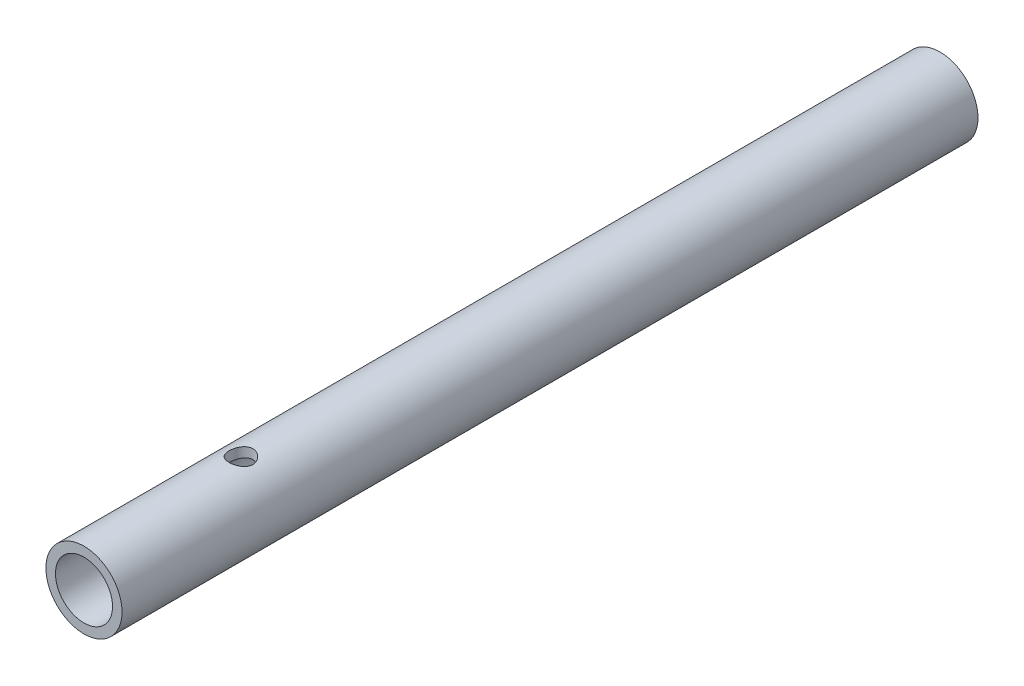
ISO-10303-21;
HEADER;
FILE_DESCRIPTION(('STEP AP214'),'2;1');
FILE_NAME('part.step','',(''),(''),'','','');
FILE_SCHEMA(('AUTOMOTIVE_DESIGN { 1 0 10303 214 1 1 1 1 }'));
ENDSEC;
DATA;
#1=APPLICATION_CONTEXT('core data for automotive mechanical design processes');
#2=APPLICATION_PROTOCOL_DEFINITION('international standard','automotive_design',2000,#1);
#3=PRODUCT_CONTEXT('',#1,'mechanical');
#4=PRODUCT('Part','Part','',(#3));
#5=PRODUCT_RELATED_PRODUCT_CATEGORY('part','',(#4));
#6=PRODUCT_DEFINITION_FORMATION('','',#4);
#7=PRODUCT_DEFINITION_CONTEXT('part definition',#1,'design');
#8=PRODUCT_DEFINITION('design','',#6,#7);
#9=PRODUCT_DEFINITION_SHAPE('','',#8);
#10=(LENGTH_UNIT() NAMED_UNIT(*) SI_UNIT(.MILLI.,.METRE.));
#11=(NAMED_UNIT(*) PLANE_ANGLE_UNIT() SI_UNIT($,.RADIAN.));
#12=(NAMED_UNIT(*) SI_UNIT($,.STERADIAN.) SOLID_ANGLE_UNIT());
#13=UNCERTAINTY_MEASURE_WITH_UNIT(LENGTH_MEASURE(1.E-05),#10,'distance_accuracy_value','');
#14=(GEOMETRIC_REPRESENTATION_CONTEXT(3) GLOBAL_UNCERTAINTY_ASSIGNED_CONTEXT((#13)) GLOBAL_UNIT_ASSIGNED_CONTEXT((#10,
#11,#12)) REPRESENTATION_CONTEXT('',''));
#15=CARTESIAN_POINT('',(0.,0.,0.));
#16=DIRECTION('',(0.,0.,1.));
#17=DIRECTION('',(1.,0.,0.));
#18=AXIS2_PLACEMENT_3D('',#15,#16,#17);
#19=CARTESIAN_POINT('',(0.,-10.,-16.5));
#20=DIRECTION('',(0.,1.,0.));
#21=DIRECTION('',(0.,0.,1.));
#22=AXIS2_PLACEMENT_3D('',#19,#20,#21);
#23=CYLINDRICAL_SURFACE('',#22,1.25);
#24=CARTESIAN_POINT('',(0.,-3.,-15.25));
#25=CARTESIAN_POINT('',(0.066958052636267,-2.99999458367272,-15.2500072050913));
#26=CARTESIAN_POINT('',(0.134021397063841,-2.9977323297471,-15.2554119585281));
#27=CARTESIAN_POINT('',(0.266247371156348,-2.98890153579552,-15.2768390649202));
#28=CARTESIAN_POINT('',(0.331404576423565,-2.98232175901028,-15.2928891244642));
#29=CARTESIAN_POINT('',(0.457688733653089,-2.96556289038127,-15.3349110917806));
#30=CARTESIAN_POINT('',(0.51882852442627,-2.95539599975004,-15.3608493894681));
#31=CARTESIAN_POINT('',(0.635829756679804,-2.93245286470664,-15.4217728232326));
#32=CARTESIAN_POINT('',(0.691692790015942,-2.91967741092849,-15.4567552189709));
#33=CARTESIAN_POINT('',(0.799448403559514,-2.89207828351869,-15.5366289825909));
#34=CARTESIAN_POINT('',(0.851041267517771,-2.87718753326093,-15.5819013087898));
#35=CARTESIAN_POINT('',(0.946159821091264,-2.84732714068513,-15.6802643347826));
#36=CARTESIAN_POINT('',(0.989681263153087,-2.83235746106809,-15.7333591248945));
#37=CARTESIAN_POINT('',(1.06953737697066,-2.80321021812995,-15.8490267775649));
#38=CARTESIAN_POINT('',(1.10541308153925,-2.78910786873385,-15.9119374484265));
#39=CARTESIAN_POINT('',(1.16593940588866,-2.76435572357005,-16.0435732579209));
#40=CARTESIAN_POINT('',(1.19059580836291,-2.75370415000823,-16.1122953794845));
#41=CARTESIAN_POINT('',(1.22674598312159,-2.73778555387705,-16.2501536917679));
#42=CARTESIAN_POINT('',(1.23881657877606,-2.73228387651787,-16.3191104833922));
#43=CARTESIAN_POINT('',(1.25125209967796,-2.72661326219504,-16.4582732926866));
#44=CARTESIAN_POINT('',(1.25162348054397,-2.7264413842526,-16.5284786000257));
#45=CARTESIAN_POINT('',(1.24108450363674,-2.73125119560853,-16.6624000604349));
#46=CARTESIAN_POINT('',(1.23103681112301,-2.73583882723623,-16.7262010965645));
#47=CARTESIAN_POINT('',(1.20139191015777,-2.74898482773796,-16.8511120910004));
#48=CARTESIAN_POINT('',(1.18179287287177,-2.75754395703564,-16.9122215314918));
#49=CARTESIAN_POINT('',(1.13321958727571,-2.77786184772756,-17.0315577029914));
#50=CARTESIAN_POINT('',(1.10405471539236,-2.78968481949136,-17.0896954209134));
#51=CARTESIAN_POINT('',(1.03731242580563,-2.81518331141086,-17.2004777338801));
#52=CARTESIAN_POINT('',(0.999731690519547,-2.82885956129779,-17.2531201506135));
#53=CARTESIAN_POINT('',(0.913495965543838,-2.85792976877979,-17.3560999587328));
#54=CARTESIAN_POINT('',(0.864173483207528,-2.87337121404473,-17.4058665673854));
#55=CARTESIAN_POINT('',(0.757729591051513,-2.90325673112529,-17.4966135029592));
#56=CARTESIAN_POINT('',(0.700606359448458,-2.9177005687701,-17.5375917716922));
#57=CARTESIAN_POINT('',(0.578447948693378,-2.94438283556473,-17.6104358236163));
#58=CARTESIAN_POINT('',(0.513260582447682,-2.95656266543334,-17.6420694451507));
#59=CARTESIAN_POINT('',(0.377852402526833,-2.97689481414803,-17.6937211396033));
#60=CARTESIAN_POINT('',(0.307634394795035,-2.985049358458,-17.7137456319438));
#61=CARTESIAN_POINT('',(0.168928113346228,-2.99599641186385,-17.7404159921266));
#62=CARTESIAN_POINT('',(0.100611285278639,-2.99909541047125,-17.7478278574437));
#63=CARTESIAN_POINT('',(-0.036354655496089,-3.00056050368745,-17.7513462236141));
#64=CARTESIAN_POINT('',(-0.105003667152636,-2.99892795711939,-17.747455970252));
#65=CARTESIAN_POINT('',(-0.237098242341435,-2.9913121765694,-17.7290289151939));
#66=CARTESIAN_POINT('',(-0.300632966639385,-2.9855488728399,-17.7150300459028));
#67=CARTESIAN_POINT('',(-0.42438274897109,-2.97048606772414,-17.6775318054592));
#68=CARTESIAN_POINT('',(-0.48459738651836,-2.96118611959704,-17.6540312340497));
#69=CARTESIAN_POINT('',(-0.602108999869135,-2.93958270645166,-17.5974290242879));
#70=CARTESIAN_POINT('',(-0.659257236855322,-2.92719491469281,-17.564051816854));
#71=CARTESIAN_POINT('',(-0.767346216231427,-2.9007380457909,-17.4889466222083));
#72=CARTESIAN_POINT('',(-0.81828435260194,-2.88666826768733,-17.4472151484707));
#73=CARTESIAN_POINT('',(-0.916333430274263,-2.85712087895438,-17.3530967667276));
#74=CARTESIAN_POINT('',(-0.962910697979834,-2.84161451591029,-17.3001614970137));
#75=CARTESIAN_POINT('',(-1.04666984610551,-2.81184336768005,-17.1869787240646));
#76=CARTESIAN_POINT('',(-1.08384959285617,-2.79757886493439,-17.1267295648283));
#77=CARTESIAN_POINT('',(-1.14815960208699,-2.77181386243988,-16.9993858246974));
#78=CARTESIAN_POINT('',(-1.17513918237329,-2.76035562555111,-16.9322059644852));
#79=CARTESIAN_POINT('',(-1.21717413951573,-2.74208355658957,-16.7936294061899));
#80=CARTESIAN_POINT('',(-1.23223934863688,-2.73526589555752,-16.7222362375167));
#81=CARTESIAN_POINT('',(-1.24904080348901,-2.72763164537264,-16.5831813008008));
#82=CARTESIAN_POINT('',(-1.25171380413129,-2.72639350967163,-16.5156553377074));
#83=CARTESIAN_POINT('',(-1.24615575523912,-2.72893853011024,-16.3811571388589));
#84=CARTESIAN_POINT('',(-1.23792637964722,-2.73272091540306,-16.3141848196863));
#85=CARTESIAN_POINT('',(-1.21158404780491,-2.74449551302268,-16.1859072525311));
#86=CARTESIAN_POINT('',(-1.19394903571466,-2.7522835484648,-16.1244833265366));
#87=CARTESIAN_POINT('',(-1.14976328202135,-2.77103181199189,-16.0054519786428));
#88=CARTESIAN_POINT('',(-1.12321003517252,-2.78199293131693,-15.9478456346012));
#89=CARTESIAN_POINT('',(-1.0601028593549,-2.80666954560013,-15.8343041040509));
#90=CARTESIAN_POINT('',(-1.02304360910483,-2.82051102713679,-15.7786776698317));
#91=CARTESIAN_POINT('',(-0.940684072630391,-2.84903689053839,-15.6741398606393));
#92=CARTESIAN_POINT('',(-0.89538092890562,-2.86372156345875,-15.6252308243994));
#93=CARTESIAN_POINT('',(-0.793902045778822,-2.89356392850106,-15.5318513183153));
#94=CARTESIAN_POINT('',(-0.737174739949029,-2.90867817511792,-15.4879635671593));
#95=CARTESIAN_POINT('',(-0.616600079253201,-2.9366014362202,-15.4103005464564));
#96=CARTESIAN_POINT('',(-0.552749497945748,-2.9494093991674,-15.3765298851104));
#97=CARTESIAN_POINT('',(-0.420732056717952,-2.97109183362461,-15.3207901545601));
#98=CARTESIAN_POINT('',(-0.352653990980638,-2.98002782581964,-15.2986352333827));
#99=CARTESIAN_POINT('',(-0.213410421846561,-2.99321009768625,-15.2662936709222));
#100=CARTESIAN_POINT('',(-0.14225531698096,-2.99747105811967,-15.2560695574701));
#101=CARTESIAN_POINT('',(-0.047236081919185,-2.99972287568934,-15.2506668389136));
#102=CARTESIAN_POINT('',(-0.023624594675658,-3.00000191102536,-15.2499974578508));
#103=CARTESIAN_POINT('',(0.,-3.,-15.25));
#104=B_SPLINE_CURVE_WITH_KNOTS('',3,(#24,#25,#26,#27,#28,#29,#30,#31,#32,#33,#34,#35,#36,#37,
#38,#39,#40,#41,#42,#43,#44,#45,#46,#47,#48,#49,#50,#51,#52,#53,#54,#55,#56,#57,#58,#59,#60,#61,
#62,#63,#64,#65,#66,#67,#68,#69,#70,#71,#72,#73,#74,#75,#76,#77,#78,#79,#80,#81,#82,#83,#84,#85,
#86,#87,#88,#89,#90,#91,#92,#93,#94,#95,#96,#97,#98,#99,#100,#101,#102,#103),.UNSPECIFIED.,.T.,
.F.,(4,2,2,2,2,2,2,2,2,2,2,2,2,2,2,2,2,2,2,2,2,2,2,2,2,2,2,2,2,2,2,2,2,2,2,2,2,2,2,4),(0.,
0.200806918883939,0.402138540628698,0.602791851906303,0.803384436852977,1.01317936288807,
1.22308438131466,1.44331724539126,1.66343646730588,1.87295273137558,2.08235338249046,
2.27570157202557,2.46908679727213,2.66658713058715,2.86416545717207,3.07844141127897,
3.29276749314588,3.51204055060814,3.73119224218298,3.93648443393251,4.14171767493172,
4.33676589735722,4.53183876601785,4.73297135272161,4.93418805469496,5.14978488029295,
5.36543061240342,5.58414788359524,5.80268447074581,6.00439877559645,6.20608211297537,
6.39837649964764,6.59072494950614,6.79463893397442,6.99862373425945,7.2174653500489,
7.43640649428583,7.65172855819386,7.86637250469322,7.93722256499099),.UNSPECIFIED.);
#105=CARTESIAN_POINT('',(0.,-3.,-15.25));
#106=VERTEX_POINT('',#105);
#107=EDGE_CURVE('E38',#106,#106,#104,.T.);
#108=ORIENTED_EDGE('',*,*,#107,.T.);
#109=EDGE_LOOP('',(#108));
#110=FACE_BOUND('',#109,.T.);
#111=CARTESIAN_POINT('',(0.,-4.,-15.25));
#112=CARTESIAN_POINT('',(-0.0684391851745466,-3.99999965877989,-15.2500004465876));
#113=CARTESIAN_POINT('',(-0.136883052502859,-3.99822694984841,-15.2556392269445));
#114=CARTESIAN_POINT('',(-0.271769209588449,-3.99132894088807,-15.2779862415392));
#115=CARTESIAN_POINT('',(-0.338211042725908,-3.9862028819986,-15.2946969813644));
#116=CARTESIAN_POINT('',(-0.467128543650806,-3.97315815697909,-15.3385693711957));
#117=CARTESIAN_POINT('',(-0.529610176985803,-3.96524381499025,-15.365714844653));
#118=CARTESIAN_POINT('',(-0.64913480234646,-3.94743969161093,-15.4296173176783));
#119=CARTESIAN_POINT('',(-0.706176935444886,-3.93754959899905,-15.4663758317806));
#120=CARTESIAN_POINT('',(-0.814965334952282,-3.91650213740282,-15.5496559920174));
#121=CARTESIAN_POINT('',(-0.86652002815666,-3.90531715926989,-15.5964208850611));
#122=CARTESIAN_POINT('',(-0.961197382036994,-3.88310046374209,-15.6978683924136));
#123=CARTESIAN_POINT('',(-1.0043184728987,-3.87206877523457,-15.7525524774945));
#124=CARTESIAN_POINT('',(-1.08194336483114,-3.85111144698172,-15.8699445638081));
#125=CARTESIAN_POINT('',(-1.11620784150129,-3.84121988301796,-15.9328174775272));
#126=CARTESIAN_POINT('',(-1.17359741076672,-3.82407801799234,-16.0637923149819));
#127=CARTESIAN_POINT('',(-1.19672543771945,-3.81682702128688,-16.1318928557939));
#128=CARTESIAN_POINT('',(-1.23048459930033,-3.80607606984501,-16.2692280774521));
#129=CARTESIAN_POINT('',(-1.24147110007865,-3.80246972929508,-16.3383668436389));
#130=CARTESIAN_POINT('',(-1.25174555036988,-3.7991005514095,-16.4775931189119));
#131=CARTESIAN_POINT('',(-1.25103660995772,-3.79933669227334,-16.5476803708217));
#132=CARTESIAN_POINT('',(-1.23821824732739,-3.80353189075438,-16.683874460269));
#133=CARTESIAN_POINT('',(-1.22656057869383,-3.80734341745949,-16.7500291258616));
#134=CARTESIAN_POINT('',(-1.19290813355626,-3.81802025652489,-16.8793921565373));
#135=CARTESIAN_POINT('',(-1.17091225844551,-3.82488589343115,-16.9426002077088));
#136=CARTESIAN_POINT('',(-1.11688874681277,-3.84101044014297,-17.0653519444326));
#137=CARTESIAN_POINT('',(-1.08471925662082,-3.85030284660824,-17.124828610692));
#138=CARTESIAN_POINT('',(-1.01136020737848,-3.8702185658007,-17.2376877678791));
#139=CARTESIAN_POINT('',(-0.970168305215774,-3.88084222394551,-17.2910686702537));
#140=CARTESIAN_POINT('',(-0.877716954182124,-3.90281527800493,-17.392774943417));
#141=CARTESIAN_POINT('',(-0.826084570592818,-3.91417569605696,-17.4407595577797));
#142=CARTESIAN_POINT('',(-0.715364408095531,-3.9359157075958,-17.5274718935797));
#143=CARTESIAN_POINT('',(-0.656276077349021,-3.94629522838372,-17.5661989292192));
#144=CARTESIAN_POINT('',(-0.531664610465455,-3.96501294890191,-17.6335276886013));
#145=CARTESIAN_POINT('',(-0.46609490691928,-3.97333460648208,-17.662048135464));
#146=CARTESIAN_POINT('',(-0.330767977782645,-3.98687955828554,-17.7075530008516));
#147=CARTESIAN_POINT('',(-0.261012030724609,-3.99210379325151,-17.7245409222384));
#148=CARTESIAN_POINT('',(-0.122185157290345,-3.99871389395014,-17.745918042579));
#149=CARTESIAN_POINT('',(-0.0531918487888424,-4.00024022895439,-17.7507685435935));
#150=CARTESIAN_POINT('',(0.0846303057325847,-3.99969799730981,-17.7490337733627));
#151=CARTESIAN_POINT('',(0.153459174306505,-3.99762995581125,-17.7424501726774));
#152=CARTESIAN_POINT('',(0.287219332975852,-3.99022363769772,-17.7184044073936));
#153=CARTESIAN_POINT('',(0.352204978420947,-3.98496793110725,-17.7012167323875));
#154=CARTESIAN_POINT('',(0.478351928861365,-3.97180121379252,-17.6567856476333));
#155=CARTESIAN_POINT('',(0.539512760449015,-3.96388987514204,-17.6295409959751));
#156=CARTESIAN_POINT('',(0.657932406672231,-3.94598542759568,-17.5650267834512));
#157=CARTESIAN_POINT('',(0.715059739787954,-3.9359462681821,-17.5275290125028));
#158=CARTESIAN_POINT('',(0.822365850960094,-3.91493410002887,-17.443846789883));
#159=CARTESIAN_POINT('',(0.872542738043336,-3.90396083845862,-17.3976599822569));
#160=CARTESIAN_POINT('',(0.966587462919656,-3.88176994885247,-17.2957411099463));
#161=CARTESIAN_POINT('',(1.01012652339774,-3.87055986714446,-17.2397033362547));
#162=CARTESIAN_POINT('',(1.08721250244909,-3.84961947087602,-17.1208733836293));
#163=CARTESIAN_POINT('',(1.12075957972524,-3.839889132814,-17.0580813119956));
#164=CARTESIAN_POINT('',(1.17670083481141,-3.82311782360754,-16.9276548271141));
#165=CARTESIAN_POINT('',(1.19913819558886,-3.81606646468027,-16.8600403504953));
#166=CARTESIAN_POINT('',(1.23222894320964,-3.80551170941212,-16.7217275066762));
#167=CARTESIAN_POINT('',(1.2428868141461,-3.80200696302675,-16.6510303236287));
#168=CARTESIAN_POINT('',(1.2517940615754,-3.79908292712494,-16.5119959124458));
#169=CARTESIAN_POINT('',(1.25058279621957,-3.79948604683077,-16.4436965461871));
#170=CARTESIAN_POINT('',(1.23708818129474,-3.80390090472383,-16.3083254150808));
#171=CARTESIAN_POINT('',(1.22480534822559,-3.80791247457319,-16.241253593116));
#172=CARTESIAN_POINT('',(1.18987729913378,-3.81896814158112,-16.1112059603982));
#173=CARTESIAN_POINT('',(1.16738642405944,-3.82596698183474,-16.048184558904));
#174=CARTESIAN_POINT('',(1.11280227335064,-3.84219704261348,-15.9267595864686));
#175=CARTESIAN_POINT('',(1.08070704444254,-3.85142871716522,-15.8683569579223));
#176=CARTESIAN_POINT('',(1.00635675013475,-3.8715348703158,-15.7553540295594));
#177=CARTESIAN_POINT('',(0.963753335241274,-3.88245948922441,-15.7009918704996));
#178=CARTESIAN_POINT('',(0.870208996404849,-3.90448998821726,-15.6000136718882));
#179=CARTESIAN_POINT('',(0.819265842344404,-3.91559591606795,-15.553399711009));
#180=CARTESIAN_POINT('',(0.708486662823333,-3.93717271952329,-15.467717461637));
#181=CARTESIAN_POINT('',(0.648414574487381,-3.94761101730634,-15.42894526355));
#182=CARTESIAN_POINT('',(0.522279138013654,-3.96626769296916,-15.3621010848606));
#183=CARTESIAN_POINT('',(0.45621815779545,-3.97448694315832,-15.3340248978582));
#184=CARTESIAN_POINT('',(0.325747635373978,-3.98720650733461,-15.2914086323915));
#185=CARTESIAN_POINT('',(0.261670337112546,-3.99196240806139,-15.2759251326947));
#186=CARTESIAN_POINT('',(0.131729895440248,-3.99835900340486,-15.2552216400323));
#187=CARTESIAN_POINT('',(0.0658671161396747,-4.00000032839644,-15.249999570196));
#188=CARTESIAN_POINT('',(0.,-4.,-15.25));
#189=B_SPLINE_CURVE_WITH_KNOTS('',3,(#111,#112,#113,#114,#115,#116,#117,#118,#119,#120,#121,
#122,#123,#124,#125,#126,#127,#128,#129,#130,#131,#132,#133,#134,#135,#136,#137,#138,#139,#140,
#141,#142,#143,#144,#145,#146,#147,#148,#149,#150,#151,#152,#153,#154,#155,#156,#157,#158,#159,
#160,#161,#162,#163,#164,#165,#166,#167,#168,#169,#170,#171,#172,#173,#174,#175,#176,#177,#178,
#179,#180,#181,#182,#183,#184,#185,#186,#187,#188),.UNSPECIFIED.,.T.,.F.,(4,2,2,2,2,2,2,2,2,2,2,
2,2,2,2,2,2,2,2,2,2,2,2,2,2,2,2,2,2,2,2,2,2,2,2,2,2,2,4),(0.,0.20507544943251,0.410197323349067,
0.615002479202436,0.819839921558392,1.03037822195158,1.24095567431276,1.45673771247494,
1.67246286279527,1.8816915016721,2.09086450295139,2.29176917422169,2.49269519979063,
2.69655642720545,2.90047066010359,3.113667472796,3.32688007413303,3.5417546068977,
3.75656384494554,3.96307568548238,4.16955735649363,4.37090626722872,4.572280050345,
4.77856324738343,4.9849024570926,5.1994177871314,5.41392970983713,5.62760115751032,
5.84119123892432,6.04512203476055,6.24904331751086,6.44997913396672,6.65095584330175,
6.85979514006362,7.06869037373341,7.28440668126413,7.50003806666338,7.69744636651542,
7.89481470763049),.UNSPECIFIED.);
#190=CARTESIAN_POINT('',(0.,-4.,-15.25));
#191=VERTEX_POINT('',#190);
#192=EDGE_CURVE('E51',#191,#191,#189,.T.);
#193=ORIENTED_EDGE('',*,*,#192,.T.);
#194=EDGE_LOOP('',(#193));
#195=FACE_BOUND('',#194,.T.);
#196=ADVANCED_FACE('F33',(#110,#195),#23,.F.);
#197=CARTESIAN_POINT('',(0.,0.,-90.));
#198=DIRECTION('',(0.,0.,1.));
#199=DIRECTION('',(1.,0.,0.));
#200=AXIS2_PLACEMENT_3D('',#197,#198,#199);
#201=CYLINDRICAL_SURFACE('',#200,4.);
#202=ORIENTED_EDGE('',*,*,#192,.F.);
#203=EDGE_LOOP('',(#202));
#204=FACE_BOUND('',#203,.T.);
#205=CARTESIAN_POINT('',(0.,4.,-15.25));
#206=CARTESIAN_POINT('',(0.0684391851745465,3.99999965877989,-15.2500004465876));
#207=CARTESIAN_POINT('',(0.136883052502859,3.99822694984841,-15.2556392269445));
#208=CARTESIAN_POINT('',(0.271769209588449,3.99132894088807,-15.2779862415392));
#209=CARTESIAN_POINT('',(0.338211042725908,3.9862028819986,-15.2946969813644));
#210=CARTESIAN_POINT('',(0.467128543650806,3.97315815697909,-15.3385693711957));
#211=CARTESIAN_POINT('',(0.529610176985803,3.96524381499025,-15.365714844653));
#212=CARTESIAN_POINT('',(0.64913480234646,3.94743969161093,-15.4296173176783));
#213=CARTESIAN_POINT('',(0.706176935444885,3.93754959899905,-15.4663758317806));
#214=CARTESIAN_POINT('',(0.814965334952282,3.91650213740282,-15.5496559920174));
#215=CARTESIAN_POINT('',(0.86652002815666,3.90531715926989,-15.5964208850611));
#216=CARTESIAN_POINT('',(0.961197382036994,3.88310046374209,-15.6978683924136));
#217=CARTESIAN_POINT('',(1.0043184728987,3.87206877523457,-15.7525524774945));
#218=CARTESIAN_POINT('',(1.08194336483114,3.85111144698172,-15.8699445638081));
#219=CARTESIAN_POINT('',(1.11620784150129,3.84121988301796,-15.9328174775272));
#220=CARTESIAN_POINT('',(1.17359741076672,3.82407801799234,-16.0637923149819));
#221=CARTESIAN_POINT('',(1.19672543771945,3.81682702128688,-16.1318928557939));
#222=CARTESIAN_POINT('',(1.23048459930034,3.80607606984501,-16.2692280774521));
#223=CARTESIAN_POINT('',(1.24147110007865,3.80246972929508,-16.3383668436389));
#224=CARTESIAN_POINT('',(1.25174555036988,3.7991005514095,-16.4775931189119));
#225=CARTESIAN_POINT('',(1.25103660995772,3.79933669227334,-16.5476803708217));
#226=CARTESIAN_POINT('',(1.23821824732739,3.80353189075438,-16.683874460269));
#227=CARTESIAN_POINT('',(1.22656057869383,3.80734341745949,-16.7500291258616));
#228=CARTESIAN_POINT('',(1.19290813355626,3.81802025652489,-16.8793921565373));
#229=CARTESIAN_POINT('',(1.17091225844551,3.82488589343115,-16.9426002077088));
#230=CARTESIAN_POINT('',(1.11688874681277,3.84101044014297,-17.0653519444326));
#231=CARTESIAN_POINT('',(1.08471925662082,3.85030284660824,-17.124828610692));
#232=CARTESIAN_POINT('',(1.01136020737848,3.8702185658007,-17.2376877678791));
#233=CARTESIAN_POINT('',(0.970168305215774,3.88084222394551,-17.2910686702537));
#234=CARTESIAN_POINT('',(0.877716954182125,3.90281527800493,-17.392774943417));
#235=CARTESIAN_POINT('',(0.826084570592819,3.91417569605696,-17.4407595577797));
#236=CARTESIAN_POINT('',(0.715364408095533,3.9359157075958,-17.5274718935797));
#237=CARTESIAN_POINT('',(0.656276077349022,3.94629522838372,-17.5661989292192));
#238=CARTESIAN_POINT('',(0.531664610465455,3.96501294890191,-17.6335276886013));
#239=CARTESIAN_POINT('',(0.46609490691928,3.97333460648208,-17.662048135464));
#240=CARTESIAN_POINT('',(0.330767977782645,3.98687955828554,-17.7075530008516));
#241=CARTESIAN_POINT('',(0.261012030724609,3.99210379325151,-17.7245409222384));
#242=CARTESIAN_POINT('',(0.122185157290344,3.99871389395014,-17.745918042579));
#243=CARTESIAN_POINT('',(0.053191848788842,4.00024022895439,-17.7507685435935));
#244=CARTESIAN_POINT('',(-0.0846303057325851,3.99969799730981,-17.7490337733627));
#245=CARTESIAN_POINT('',(-0.153459174306506,3.99762995581125,-17.7424501726774));
#246=CARTESIAN_POINT('',(-0.287219332975852,3.99022363769772,-17.7184044073936));
#247=CARTESIAN_POINT('',(-0.352204978420947,3.98496793110725,-17.7012167323875));
#248=CARTESIAN_POINT('',(-0.478351928861365,3.97180121379252,-17.6567856476333));
#249=CARTESIAN_POINT('',(-0.539512760449016,3.96388987514203,-17.6295409959751));
#250=CARTESIAN_POINT('',(-0.657932406672231,3.94598542759568,-17.5650267834512));
#251=CARTESIAN_POINT('',(-0.715059739787954,3.9359462681821,-17.5275290125028));
#252=CARTESIAN_POINT('',(-0.822365850960094,3.91493410002887,-17.443846789883));
#253=CARTESIAN_POINT('',(-0.872542738043336,3.90396083845862,-17.3976599822569));
#254=CARTESIAN_POINT('',(-0.966587462919657,3.88176994885247,-17.2957411099463));
#255=CARTESIAN_POINT('',(-1.01012652339774,3.87055986714446,-17.2397033362547));
#256=CARTESIAN_POINT('',(-1.08721250244909,3.84961947087602,-17.1208733836293));
#257=CARTESIAN_POINT('',(-1.12075957972524,3.839889132814,-17.0580813119956));
#258=CARTESIAN_POINT('',(-1.17670083481141,3.82311782360754,-16.9276548271141));
#259=CARTESIAN_POINT('',(-1.19913819558886,3.81606646468027,-16.8600403504953));
#260=CARTESIAN_POINT('',(-1.23222894320964,3.80551170941212,-16.7217275066762));
#261=CARTESIAN_POINT('',(-1.2428868141461,3.80200696302675,-16.6510303236287));
#262=CARTESIAN_POINT('',(-1.2517940615754,3.79908292712494,-16.5119959124458));
#263=CARTESIAN_POINT('',(-1.25058279621957,3.79948604683077,-16.4436965461871));
#264=CARTESIAN_POINT('',(-1.23708818129474,3.80390090472383,-16.3083254150808));
#265=CARTESIAN_POINT('',(-1.22480534822559,3.80791247457319,-16.241253593116));
#266=CARTESIAN_POINT('',(-1.18987729913378,3.81896814158112,-16.1112059603982));
#267=CARTESIAN_POINT('',(-1.16738642405944,3.82596698183474,-16.048184558904));
#268=CARTESIAN_POINT('',(-1.11280227335064,3.84219704261348,-15.9267595864687));
#269=CARTESIAN_POINT('',(-1.08070704444254,3.85142871716522,-15.8683569579223));
#270=CARTESIAN_POINT('',(-1.00635675013475,3.8715348703158,-15.7553540295594));
#271=CARTESIAN_POINT('',(-0.963753335241274,3.88245948922441,-15.7009918704996));
#272=CARTESIAN_POINT('',(-0.870208996404849,3.90448998821726,-15.6000136718882));
#273=CARTESIAN_POINT('',(-0.819265842344404,3.91559591606795,-15.553399711009));
#274=CARTESIAN_POINT('',(-0.708486662823334,3.93717271952329,-15.467717461637));
#275=CARTESIAN_POINT('',(-0.648414574487381,3.94761101730634,-15.42894526355));
#276=CARTESIAN_POINT('',(-0.522279138013654,3.96626769296916,-15.3621010848606));
#277=CARTESIAN_POINT('',(-0.45621815779545,3.97448694315832,-15.3340248978582));
#278=CARTESIAN_POINT('',(-0.325747635373978,3.98720650733461,-15.2914086323915));
#279=CARTESIAN_POINT('',(-0.261670337112547,3.99196240806139,-15.2759251326947));
#280=CARTESIAN_POINT('',(-0.131729895440248,3.99835900340486,-15.2552216400323));
#281=CARTESIAN_POINT('',(-0.0658671161396749,4.00000032839644,-15.249999570196));
#282=CARTESIAN_POINT('',(0.,4.,-15.25));
#283=B_SPLINE_CURVE_WITH_KNOTS('',3,(#205,#206,#207,#208,#209,#210,#211,#212,#213,#214,#215,
#216,#217,#218,#219,#220,#221,#222,#223,#224,#225,#226,#227,#228,#229,#230,#231,#232,#233,#234,
#235,#236,#237,#238,#239,#240,#241,#242,#243,#244,#245,#246,#247,#248,#249,#250,#251,#252,#253,
#254,#255,#256,#257,#258,#259,#260,#261,#262,#263,#264,#265,#266,#267,#268,#269,#270,#271,#272,
#273,#274,#275,#276,#277,#278,#279,#280,#281,#282),.UNSPECIFIED.,.T.,.F.,(4,2,2,2,2,2,2,2,2,2,2,
2,2,2,2,2,2,2,2,2,2,2,2,2,2,2,2,2,2,2,2,2,2,2,2,2,2,2,4),(0.,0.20507544943251,0.410197323349067,
0.615002479202436,0.819839921558392,1.03037822195158,1.24095567431276,1.45673771247494,
1.67246286279527,1.8816915016721,2.09086450295139,2.29176917422169,2.49269519979063,
2.69655642720545,2.90047066010359,3.113667472796,3.32688007413303,3.5417546068977,
3.75656384494554,3.96307568548238,4.16955735649363,4.37090626722872,4.572280050345,
4.77856324738343,4.98490245709259,5.1994177871314,5.41392970983712,5.62760115751031,
5.84119123892431,6.04512203476054,6.24904331751085,6.44997913396672,6.65095584330175,
6.85979514006362,7.06869037373341,7.28440668126413,7.50003806666338,7.69744636651541,
7.89481470763048),.UNSPECIFIED.);
#284=CARTESIAN_POINT('',(0.,4.,-15.25));
#285=VERTEX_POINT('',#284);
#286=EDGE_CURVE('E57',#285,#285,#283,.T.);
#287=ORIENTED_EDGE('',*,*,#286,.F.);
#288=EDGE_LOOP('',(#287));
#289=FACE_BOUND('',#288,.T.);
#290=CARTESIAN_POINT('',(0.,0.,-90.));
#291=DIRECTION('',(0.,0.,1.));
#292=DIRECTION('',(1.,0.,0.));
#293=AXIS2_PLACEMENT_3D('',#290,#291,#292);
#294=CIRCLE('',#293,4.);
#295=CARTESIAN_POINT('',(4.,0.,-90.));
#296=VERTEX_POINT('',#295);
#297=EDGE_CURVE('E10',#296,#296,#294,.T.);
#298=ORIENTED_EDGE('',*,*,#297,.T.);
#299=EDGE_LOOP('',(#298));
#300=FACE_BOUND('',#299,.T.);
#301=CARTESIAN_POINT('',(0.,0.,0.));
#302=DIRECTION('',(0.,0.,1.));
#303=DIRECTION('',(1.,0.,0.));
#304=AXIS2_PLACEMENT_3D('',#301,#302,#303);
#305=CIRCLE('',#304,4.);
#306=CARTESIAN_POINT('',(4.,0.,0.));
#307=VERTEX_POINT('',#306);
#308=EDGE_CURVE('E46',#307,#307,#305,.T.);
#309=ORIENTED_EDGE('',*,*,#308,.F.);
#310=EDGE_LOOP('',(#309));
#311=FACE_BOUND('',#310,.T.);
#312=ADVANCED_FACE('F35',(#204,#289,#300,#311),#201,.T.);
#313=CARTESIAN_POINT('',(0.,0.,-90.));
#314=DIRECTION('',(0.,0.,1.));
#315=DIRECTION('',(1.,0.,0.));
#316=AXIS2_PLACEMENT_3D('',#313,#314,#315);
#317=PLANE('',#316);
#318=CARTESIAN_POINT('',(0.,0.,-90.));
#319=DIRECTION('',(0.,0.,1.));
#320=DIRECTION('',(1.,0.,0.));
#321=AXIS2_PLACEMENT_3D('',#318,#319,#320);
#322=CIRCLE('',#321,3.);
#323=CARTESIAN_POINT('',(3.,0.,-90.));
#324=VERTEX_POINT('',#323);
#325=EDGE_CURVE('E80',#324,#324,#322,.T.);
#326=ORIENTED_EDGE('',*,*,#325,.T.);
#327=EDGE_LOOP('',(#326));
#328=FACE_BOUND('',#327,.T.);
#329=ORIENTED_EDGE('',*,*,#297,.F.);
#330=EDGE_LOOP('',(#329));
#331=FACE_BOUND('',#330,.T.);
#332=ADVANCED_FACE('F72',(#328,#331),#317,.F.);
#333=CARTESIAN_POINT('',(0.,0.,0.));
#334=DIRECTION('',(0.,0.,1.));
#335=DIRECTION('',(1.,0.,0.));
#336=AXIS2_PLACEMENT_3D('',#333,#334,#335);
#337=PLANE('',#336);
#338=CARTESIAN_POINT('',(0.,0.,0.));
#339=DIRECTION('',(0.,0.,1.));
#340=DIRECTION('',(1.,0.,0.));
#341=AXIS2_PLACEMENT_3D('',#338,#339,#340);
#342=CIRCLE('',#341,3.);
#343=CARTESIAN_POINT('',(3.,0.,0.));
#344=VERTEX_POINT('',#343);
#345=EDGE_CURVE('E54',#344,#344,#342,.T.);
#346=ORIENTED_EDGE('',*,*,#345,.F.);
#347=EDGE_LOOP('',(#346));
#348=FACE_BOUND('',#347,.T.);
#349=ORIENTED_EDGE('',*,*,#308,.T.);
#350=EDGE_LOOP('',(#349));
#351=FACE_BOUND('',#350,.T.);
#352=ADVANCED_FACE('F69',(#348,#351),#337,.T.);
#353=CARTESIAN_POINT('',(0.,3.,-15.25));
#354=CARTESIAN_POINT('',(-0.0669580526362668,2.99999458367273,-15.2500072050913));
#355=CARTESIAN_POINT('',(-0.134021397063841,2.9977323297471,-15.2554119585281));
#356=CARTESIAN_POINT('',(-0.266247371156347,2.98890153579552,-15.2768390649202));
#357=CARTESIAN_POINT('',(-0.331404576423565,2.98232175901028,-15.2928891244642));
#358=CARTESIAN_POINT('',(-0.457688733653089,2.96556289038127,-15.3349110917806));
#359=CARTESIAN_POINT('',(-0.51882852442627,2.95539599975004,-15.3608493894681));
#360=CARTESIAN_POINT('',(-0.635829756679804,2.93245286470664,-15.4217728232326));
#361=CARTESIAN_POINT('',(-0.691692790015942,2.91967741092849,-15.4567552189709));
#362=CARTESIAN_POINT('',(-0.799448403559514,2.89207828351869,-15.5366289825909));
#363=CARTESIAN_POINT('',(-0.851041267517771,2.87718753326093,-15.5819013087898));
#364=CARTESIAN_POINT('',(-0.946159821091264,2.84732714068513,-15.6802643347826));
#365=CARTESIAN_POINT('',(-0.989681263153087,2.83235746106809,-15.7333591248945));
#366=CARTESIAN_POINT('',(-1.06953737697066,2.80321021812995,-15.8490267775649));
#367=CARTESIAN_POINT('',(-1.10541308153925,2.78910786873385,-15.9119374484265));
#368=CARTESIAN_POINT('',(-1.16593940588866,2.76435572357005,-16.0435732579209));
#369=CARTESIAN_POINT('',(-1.19059580836291,2.75370415000823,-16.1122953794845));
#370=CARTESIAN_POINT('',(-1.22674598312159,2.73778555387705,-16.2501536917679));
#371=CARTESIAN_POINT('',(-1.23881657877606,2.73228387651787,-16.3191104833922));
#372=CARTESIAN_POINT('',(-1.25125209967796,2.72661326219504,-16.4582732926866));
#373=CARTESIAN_POINT('',(-1.25162348054397,2.7264413842526,-16.5284786000257));
#374=CARTESIAN_POINT('',(-1.24108450363674,2.73125119560853,-16.6624000604349));
#375=CARTESIAN_POINT('',(-1.23103681112301,2.73583882723623,-16.7262010965645));
#376=CARTESIAN_POINT('',(-1.20139191015777,2.74898482773796,-16.8511120910004));
#377=CARTESIAN_POINT('',(-1.18179287287177,2.75754395703564,-16.9122215314918));
#378=CARTESIAN_POINT('',(-1.13321958727571,2.77786184772756,-17.0315577029914));
#379=CARTESIAN_POINT('',(-1.10405471539236,2.78968481949136,-17.0896954209134));
#380=CARTESIAN_POINT('',(-1.03731242580563,2.81518331141086,-17.2004777338801));
#381=CARTESIAN_POINT('',(-0.999731690519547,2.82885956129779,-17.2531201506135));
#382=CARTESIAN_POINT('',(-0.913495965543838,2.85792976877979,-17.3560999587328));
#383=CARTESIAN_POINT('',(-0.864173483207528,2.87337121404473,-17.4058665673854));
#384=CARTESIAN_POINT('',(-0.757729591051513,2.90325673112529,-17.4966135029592));
#385=CARTESIAN_POINT('',(-0.700606359448458,2.9177005687701,-17.5375917716922));
#386=CARTESIAN_POINT('',(-0.578447948693378,2.94438283556473,-17.6104358236163));
#387=CARTESIAN_POINT('',(-0.513260582447682,2.95656266543334,-17.6420694451507));
#388=CARTESIAN_POINT('',(-0.377852402526833,2.97689481414803,-17.6937211396033));
#389=CARTESIAN_POINT('',(-0.307634394795035,2.985049358458,-17.7137456319438));
#390=CARTESIAN_POINT('',(-0.168928113346228,2.99599641186385,-17.7404159921266));
#391=CARTESIAN_POINT('',(-0.100611285278639,2.99909541047125,-17.7478278574437));
#392=CARTESIAN_POINT('',(0.0363546554960889,3.00056050368745,-17.7513462236141));
#393=CARTESIAN_POINT('',(0.105003667152636,2.99892795711939,-17.747455970252));
#394=CARTESIAN_POINT('',(0.237098242341435,2.9913121765694,-17.7290289151939));
#395=CARTESIAN_POINT('',(0.300632966639385,2.9855488728399,-17.7150300459028));
#396=CARTESIAN_POINT('',(0.424382748971089,2.97048606772414,-17.6775318054592));
#397=CARTESIAN_POINT('',(0.48459738651836,2.96118611959704,-17.6540312340497));
#398=CARTESIAN_POINT('',(0.602108999869135,2.93958270645166,-17.5974290242879));
#399=CARTESIAN_POINT('',(0.659257236855322,2.92719491469281,-17.564051816854));
#400=CARTESIAN_POINT('',(0.767346216231427,2.9007380457909,-17.4889466222083));
#401=CARTESIAN_POINT('',(0.81828435260194,2.88666826768733,-17.4472151484707));
#402=CARTESIAN_POINT('',(0.916333430274263,2.85712087895438,-17.3530967667276));
#403=CARTESIAN_POINT('',(0.962910697979835,2.84161451591029,-17.3001614970137));
#404=CARTESIAN_POINT('',(1.04666984610551,2.81184336768005,-17.1869787240646));
#405=CARTESIAN_POINT('',(1.08384959285617,2.79757886493439,-17.1267295648283));
#406=CARTESIAN_POINT('',(1.14815960208699,2.77181386243988,-16.9993858246974));
#407=CARTESIAN_POINT('',(1.17513918237329,2.76035562555111,-16.9322059644852));
#408=CARTESIAN_POINT('',(1.21717413951573,2.74208355658957,-16.7936294061899));
#409=CARTESIAN_POINT('',(1.23223934863688,2.73526589555752,-16.7222362375167));
#410=CARTESIAN_POINT('',(1.24904080348901,2.72763164537264,-16.5831813008008));
#411=CARTESIAN_POINT('',(1.25171380413129,2.72639350967163,-16.5156553377074));
#412=CARTESIAN_POINT('',(1.24615575523912,2.72893853011024,-16.3811571388589));
#413=CARTESIAN_POINT('',(1.23792637964722,2.73272091540306,-16.3141848196863));
#414=CARTESIAN_POINT('',(1.21158404780491,2.74449551302268,-16.1859072525311));
#415=CARTESIAN_POINT('',(1.19394903571466,2.7522835484648,-16.1244833265366));
#416=CARTESIAN_POINT('',(1.14976328202135,2.77103181199189,-16.0054519786428));
#417=CARTESIAN_POINT('',(1.12321003517252,2.78199293131693,-15.9478456346012));
#418=CARTESIAN_POINT('',(1.0601028593549,2.80666954560013,-15.8343041040509));
#419=CARTESIAN_POINT('',(1.02304360910483,2.82051102713679,-15.7786776698317));
#420=CARTESIAN_POINT('',(0.940684072630392,2.84903689053839,-15.6741398606393));
#421=CARTESIAN_POINT('',(0.89538092890562,2.86372156345875,-15.6252308243994));
#422=CARTESIAN_POINT('',(0.793902045778822,2.89356392850106,-15.5318513183153));
#423=CARTESIAN_POINT('',(0.737174739949028,2.90867817511792,-15.4879635671593));
#424=CARTESIAN_POINT('',(0.6166000792532,2.9366014362202,-15.4103005464564));
#425=CARTESIAN_POINT('',(0.552749497945747,2.9494093991674,-15.3765298851104));
#426=CARTESIAN_POINT('',(0.420732056717952,2.97109183362461,-15.3207901545601));
#427=CARTESIAN_POINT('',(0.352653990980638,2.98002782581964,-15.2986352333827));
#428=CARTESIAN_POINT('',(0.213410421846561,2.99321009768625,-15.2662936709222));
#429=CARTESIAN_POINT('',(0.14225531698096,2.99747105811967,-15.2560695574701));
#430=CARTESIAN_POINT('',(0.0472360819191848,2.99972287568934,-15.2506668389136));
#431=CARTESIAN_POINT('',(0.0236245946756579,3.00000191102536,-15.2499974578508));
#432=CARTESIAN_POINT('',(0.,3.,-15.25));
#433=B_SPLINE_CURVE_WITH_KNOTS('',3,(#353,#354,#355,#356,#357,#358,#359,#360,#361,#362,#363,
#364,#365,#366,#367,#368,#369,#370,#371,#372,#373,#374,#375,#376,#377,#378,#379,#380,#381,#382,
#383,#384,#385,#386,#387,#388,#389,#390,#391,#392,#393,#394,#395,#396,#397,#398,#399,#400,#401,
#402,#403,#404,#405,#406,#407,#408,#409,#410,#411,#412,#413,#414,#415,#416,#417,#418,#419,#420,
#421,#422,#423,#424,#425,#426,#427,#428,#429,#430,#431,#432),.UNSPECIFIED.,.T.,.F.,(4,2,2,2,2,2,
2,2,2,2,2,2,2,2,2,2,2,2,2,2,2,2,2,2,2,2,2,2,2,2,2,2,2,2,2,2,2,2,2,4),(0.,0.200806918883939,
0.402138540628698,0.602791851906303,0.803384436852977,1.01317936288807,1.22308438131466,
1.44331724539126,1.66343646730588,1.87295273137558,2.08235338249046,2.27570157202556,
2.46908679727212,2.66658713058715,2.86416545717207,3.07844141127897,3.29276749314588,
3.51204055060814,3.73119224218298,3.93648443393251,4.14171767493172,4.33676589735722,
4.53183876601785,4.73297135272161,4.93418805469496,5.14978488029295,5.36543061240342,
5.58414788359524,5.80268447074581,6.00439877559644,6.20608211297537,6.39837649964764,
6.59072494950614,6.79463893397442,6.99862373425945,7.2174653500489,7.43640649428583,
7.65172855819386,7.86637250469322,7.93722256499099),.UNSPECIFIED.);
#434=CARTESIAN_POINT('',(0.,3.,-15.25));
#435=VERTEX_POINT('',#434);
#436=EDGE_CURVE('E76',#435,#435,#433,.T.);
#437=ORIENTED_EDGE('',*,*,#436,.T.);
#438=EDGE_LOOP('',(#437));
#439=FACE_BOUND('',#438,.T.);
#440=ORIENTED_EDGE('',*,*,#286,.T.);
#441=EDGE_LOOP('',(#440));
#442=FACE_BOUND('',#441,.T.);
#443=ADVANCED_FACE('F64',(#439,#442),#23,.F.);
#444=CARTESIAN_POINT('',(0.,0.,-90.));
#445=DIRECTION('',(0.,0.,1.));
#446=DIRECTION('',(1.,0.,0.));
#447=AXIS2_PLACEMENT_3D('',#444,#445,#446);
#448=CYLINDRICAL_SURFACE('',#447,3.);
#449=ORIENTED_EDGE('',*,*,#436,.F.);
#450=EDGE_LOOP('',(#449));
#451=FACE_BOUND('',#450,.T.);
#452=ORIENTED_EDGE('',*,*,#325,.F.);
#453=EDGE_LOOP('',(#452));
#454=FACE_BOUND('',#453,.T.);
#455=ORIENTED_EDGE('',*,*,#345,.T.);
#456=EDGE_LOOP('',(#455));
#457=FACE_BOUND('',#456,.T.);
#458=ORIENTED_EDGE('',*,*,#107,.F.);
#459=EDGE_LOOP('',(#458));
#460=FACE_BOUND('',#459,.T.);
#461=ADVANCED_FACE('F68',(#451,#454,#457,#460),#448,.F.);
#462=CLOSED_SHELL('',(#196,#312,#332,#352,#443,#461));
#463=MANIFOLD_SOLID_BREP('B2',#462);
#464=ADVANCED_BREP_SHAPE_REPRESENTATION('',(#18,#463),#14);
#465=SHAPE_DEFINITION_REPRESENTATION(#9,#464);
ENDSEC;
END-ISO-10303-21;
